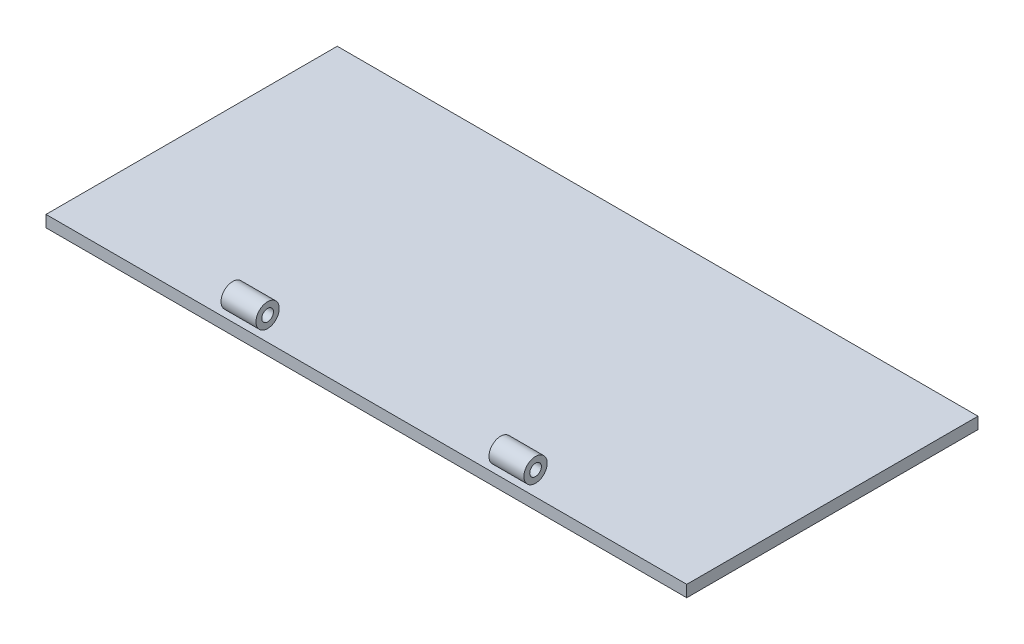
ISO-10303-21;
HEADER;
FILE_DESCRIPTION(('STEP AP214'),'2;1');
FILE_NAME('part.step','',(''),(''),'','','');
FILE_SCHEMA(('AUTOMOTIVE_DESIGN { 1 0 10303 214 1 1 1 1 }'));
ENDSEC;
DATA;
#1=APPLICATION_CONTEXT('core data for automotive mechanical design processes');
#2=APPLICATION_PROTOCOL_DEFINITION('international standard','automotive_design',2000,#1);
#3=PRODUCT_CONTEXT('',#1,'mechanical');
#4=PRODUCT('Part','Part','',(#3));
#5=PRODUCT_RELATED_PRODUCT_CATEGORY('part','',(#4));
#6=PRODUCT_DEFINITION_FORMATION('','',#4);
#7=PRODUCT_DEFINITION_CONTEXT('part definition',#1,'design');
#8=PRODUCT_DEFINITION('design','',#6,#7);
#9=PRODUCT_DEFINITION_SHAPE('','',#8);
#10=(LENGTH_UNIT() NAMED_UNIT(*) SI_UNIT(.MILLI.,.METRE.));
#11=(NAMED_UNIT(*) PLANE_ANGLE_UNIT() SI_UNIT($,.RADIAN.));
#12=(NAMED_UNIT(*) SI_UNIT($,.STERADIAN.) SOLID_ANGLE_UNIT());
#13=UNCERTAINTY_MEASURE_WITH_UNIT(LENGTH_MEASURE(1.E-05),#10,'distance_accuracy_value','');
#14=(GEOMETRIC_REPRESENTATION_CONTEXT(3) GLOBAL_UNCERTAINTY_ASSIGNED_CONTEXT((#13)) GLOBAL_UNIT_ASSIGNED_CONTEXT((#10,
#11,#12)) REPRESENTATION_CONTEXT('',''));
#15=CARTESIAN_POINT('',(0.,0.,0.));
#16=DIRECTION('',(0.,0.,1.));
#17=DIRECTION('',(1.,0.,0.));
#18=AXIS2_PLACEMENT_3D('',#15,#16,#17);
#19=CARTESIAN_POINT('',(180.,27.7098085245449,83.2934951748712));
#20=DIRECTION('',(-1.,0.,0.));
#21=DIRECTION('',(0.,0.,1.));
#22=AXIS2_PLACEMENT_3D('',#19,#20,#21);
#23=CYLINDRICAL_SURFACE('',#22,9.99999999999999);
#24=CARTESIAN_POINT('',(180.,27.7098085245449,83.2934951748712));
#25=DIRECTION('',(-1.,0.,0.));
#26=DIRECTION('',(0.,0.,1.));
#27=AXIS2_PLACEMENT_3D('',#24,#25,#26);
#28=CIRCLE('',#27,9.99999999999999);
#29=CARTESIAN_POINT('',(180.,27.7098085245449,93.2934951748712));
#30=VERTEX_POINT('',#29);
#31=EDGE_CURVE('E12',#30,#30,#28,.T.);
#32=CARTESIAN_POINT('',(150.,27.7098085245449,83.2934951748712));
#33=DIRECTION('',(-1.,0.,0.));
#34=DIRECTION('',(0.,0.,1.));
#35=AXIS2_PLACEMENT_3D('',#32,#33,#34);
#36=CIRCLE('',#35,9.99999999999999);
#37=CARTESIAN_POINT('',(150.,27.7098085245449,93.2934951748712));
#38=VERTEX_POINT('',#37);
#39=EDGE_CURVE('E66',#38,#38,#36,.T.);
#40=CARTESIAN_POINT('',(180.,27.7098085245449,93.2934951748712));
#41=CARTESIAN_POINT('',(179.6875,27.7098085245449,93.2934951748712));
#42=CARTESIAN_POINT('',(179.375,27.7098085245449,93.2934951748712));
#43=CARTESIAN_POINT('',(178.75,27.7098085245449,93.2934951748712));
#44=CARTESIAN_POINT('',(178.4375,27.7098085245449,93.2934951748712));
#45=CARTESIAN_POINT('',(177.8125,27.7098085245449,93.2934951748712));
#46=CARTESIAN_POINT('',(177.5,27.7098085245449,93.2934951748712));
#47=CARTESIAN_POINT('',(176.875,27.7098085245449,93.2934951748712));
#48=CARTESIAN_POINT('',(176.5625,27.7098085245449,93.2934951748712));
#49=CARTESIAN_POINT('',(175.9375,27.7098085245449,93.2934951748712));
#50=CARTESIAN_POINT('',(175.625,27.7098085245449,93.2934951748712));
#51=CARTESIAN_POINT('',(175.,27.7098085245449,93.2934951748712));
#52=CARTESIAN_POINT('',(174.6875,27.7098085245449,93.2934951748712));
#53=CARTESIAN_POINT('',(174.0625,27.7098085245449,93.2934951748712));
#54=CARTESIAN_POINT('',(173.75,27.7098085245449,93.2934951748712));
#55=CARTESIAN_POINT('',(173.125,27.7098085245449,93.2934951748712));
#56=CARTESIAN_POINT('',(172.8125,27.7098085245449,93.2934951748712));
#57=CARTESIAN_POINT('',(172.1875,27.7098085245449,93.2934951748712));
#58=CARTESIAN_POINT('',(171.875,27.7098085245449,93.2934951748712));
#59=CARTESIAN_POINT('',(171.25,27.7098085245449,93.2934951748712));
#60=CARTESIAN_POINT('',(170.9375,27.7098085245449,93.2934951748712));
#61=CARTESIAN_POINT('',(170.3125,27.7098085245449,93.2934951748712));
#62=CARTESIAN_POINT('',(170.,27.7098085245449,93.2934951748712));
#63=CARTESIAN_POINT('',(169.375,27.7098085245449,93.2934951748712));
#64=CARTESIAN_POINT('',(169.0625,27.7098085245449,93.2934951748712));
#65=CARTESIAN_POINT('',(168.4375,27.7098085245449,93.2934951748712));
#66=CARTESIAN_POINT('',(168.125,27.7098085245449,93.2934951748712));
#67=CARTESIAN_POINT('',(167.5,27.7098085245449,93.2934951748712));
#68=CARTESIAN_POINT('',(167.1875,27.7098085245449,93.2934951748712));
#69=CARTESIAN_POINT('',(166.5625,27.7098085245449,93.2934951748712));
#70=CARTESIAN_POINT('',(166.25,27.7098085245449,93.2934951748712));
#71=CARTESIAN_POINT('',(165.625,27.7098085245449,93.2934951748712));
#72=CARTESIAN_POINT('',(165.3125,27.7098085245449,93.2934951748712));
#73=CARTESIAN_POINT('',(164.6875,27.7098085245449,93.2934951748712));
#74=CARTESIAN_POINT('',(164.375,27.7098085245449,93.2934951748712));
#75=CARTESIAN_POINT('',(163.75,27.7098085245449,93.2934951748712));
#76=CARTESIAN_POINT('',(163.4375,27.7098085245449,93.2934951748712));
#77=CARTESIAN_POINT('',(162.8125,27.7098085245449,93.2934951748712));
#78=CARTESIAN_POINT('',(162.5,27.7098085245449,93.2934951748712));
#79=CARTESIAN_POINT('',(161.875,27.7098085245449,93.2934951748712));
#80=CARTESIAN_POINT('',(161.5625,27.7098085245449,93.2934951748712));
#81=CARTESIAN_POINT('',(160.9375,27.7098085245449,93.2934951748712));
#82=CARTESIAN_POINT('',(160.625,27.7098085245449,93.2934951748712));
#83=CARTESIAN_POINT('',(160.,27.7098085245449,93.2934951748712));
#84=CARTESIAN_POINT('',(159.6875,27.7098085245449,93.2934951748712));
#85=CARTESIAN_POINT('',(159.0625,27.7098085245449,93.2934951748712));
#86=CARTESIAN_POINT('',(158.75,27.7098085245449,93.2934951748712));
#87=CARTESIAN_POINT('',(158.125,27.7098085245449,93.2934951748712));
#88=CARTESIAN_POINT('',(157.8125,27.7098085245449,93.2934951748712));
#89=CARTESIAN_POINT('',(157.1875,27.7098085245449,93.2934951748712));
#90=CARTESIAN_POINT('',(156.875,27.7098085245449,93.2934951748712));
#91=CARTESIAN_POINT('',(156.25,27.7098085245449,93.2934951748712));
#92=CARTESIAN_POINT('',(155.9375,27.7098085245449,93.2934951748712));
#93=CARTESIAN_POINT('',(155.3125,27.7098085245449,93.2934951748712));
#94=CARTESIAN_POINT('',(155.,27.7098085245449,93.2934951748712));
#95=CARTESIAN_POINT('',(154.375,27.7098085245449,93.2934951748712));
#96=CARTESIAN_POINT('',(154.0625,27.7098085245449,93.2934951748712));
#97=CARTESIAN_POINT('',(153.4375,27.7098085245449,93.2934951748712));
#98=CARTESIAN_POINT('',(153.125,27.7098085245449,93.2934951748712));
#99=CARTESIAN_POINT('',(152.5,27.7098085245449,93.2934951748712));
#100=CARTESIAN_POINT('',(152.1875,27.7098085245449,93.2934951748712));
#101=CARTESIAN_POINT('',(151.5625,27.7098085245449,93.2934951748712));
#102=CARTESIAN_POINT('',(151.25,27.7098085245449,93.2934951748712));
#103=CARTESIAN_POINT('',(150.625,27.7098085245449,93.2934951748712));
#104=CARTESIAN_POINT('',(150.3125,27.7098085245449,93.2934951748712));
#105=CARTESIAN_POINT('',(150.,27.7098085245449,93.2934951748712));
#106=B_SPLINE_CURVE_WITH_KNOTS('',3,(#40,#41,#42,#43,#44,#45,#46,#47,#48,#49,#50,#51,#52,#53,
#54,#55,#56,#57,#58,#59,#60,#61,#62,#63,#64,#65,#66,#67,#68,#69,#70,#71,#72,#73,#74,#75,#76,#77,
#78,#79,#80,#81,#82,#83,#84,#85,#86,#87,#88,#89,#90,#91,#92,#93,#94,#95,#96,#97,#98,#99,#100,
#101,#102,#103,#104,#105),.UNSPECIFIED.,.F.,.F.,(4,2,2,2,2,2,2,2,2,2,2,2,2,2,2,2,2,2,2,2,2,2,2,
2,2,2,2,2,2,2,2,2,4),(0.,0.937500000000008,1.87500000000002,2.81250000000002,3.75,
4.68750000000001,5.62500000000002,6.56250000000003,7.50000000000001,8.43750000000001,
9.37500000000002,10.3125,11.25,12.1875,13.125,14.0625,15.,15.9375,16.875,17.8125,18.75,19.6875,
20.625,21.5625,22.5,23.4375,24.375,25.3125,26.25,27.1875,28.125,29.0625,30.),.UNSPECIFIED.);
#107=EDGE_CURVE('BSEAM60',#30,#38,#106,.T.);
#108=ORIENTED_EDGE('',*,*,#31,.T.);
#109=ORIENTED_EDGE('',*,*,#39,.F.);
#110=ORIENTED_EDGE('',*,*,#107,.T.);
#111=ORIENTED_EDGE('',*,*,#107,.F.);
#112=EDGE_LOOP('',(#108,#110,#109,#111));
#113=FACE_BOUND('',#112,.T.);
#114=ADVANCED_FACE('F60',(#113),#23,.T.);
#115=CARTESIAN_POINT('',(180.,27.7098085245449,83.2934951748712));
#116=DIRECTION('',(-1.,0.,0.));
#117=DIRECTION('',(0.,0.,1.));
#118=AXIS2_PLACEMENT_3D('',#115,#116,#117);
#119=PLANE('',#118);
#120=CARTESIAN_POINT('',(180.,27.7098085245449,83.2934951748712));
#121=DIRECTION('',(-1.,0.,0.));
#122=DIRECTION('',(0.,0.,1.));
#123=AXIS2_PLACEMENT_3D('',#120,#121,#122);
#124=CIRCLE('',#123,5.);
#125=CARTESIAN_POINT('',(180.,27.7098085245449,88.2934951748712));
#126=VERTEX_POINT('',#125);
#127=EDGE_CURVE('E70',#126,#126,#124,.T.);
#128=ORIENTED_EDGE('',*,*,#127,.T.);
#129=EDGE_LOOP('',(#128));
#130=FACE_BOUND('',#129,.T.);
#131=ORIENTED_EDGE('',*,*,#31,.F.);
#132=EDGE_LOOP('',(#131));
#133=FACE_BOUND('',#132,.T.);
#134=ADVANCED_FACE('F85',(#130,#133),#119,.F.);
#135=CARTESIAN_POINT('',(150.,27.7098085245449,83.2934951748712));
#136=DIRECTION('',(-1.,0.,0.));
#137=DIRECTION('',(0.,0.,1.));
#138=AXIS2_PLACEMENT_3D('',#135,#136,#137);
#139=PLANE('',#138);
#140=CARTESIAN_POINT('',(150.,27.7098085245449,83.2934951748712));
#141=DIRECTION('',(-1.,0.,0.));
#142=DIRECTION('',(0.,0.,1.));
#143=AXIS2_PLACEMENT_3D('',#140,#141,#142);
#144=CIRCLE('',#143,5.);
#145=CARTESIAN_POINT('',(150.,27.7098085245449,88.2934951748712));
#146=VERTEX_POINT('',#145);
#147=EDGE_CURVE('E74',#146,#146,#144,.T.);
#148=ORIENTED_EDGE('',*,*,#147,.F.);
#149=EDGE_LOOP('',(#148));
#150=FACE_BOUND('',#149,.T.);
#151=ORIENTED_EDGE('',*,*,#39,.T.);
#152=EDGE_LOOP('',(#151));
#153=FACE_BOUND('',#152,.T.);
#154=ADVANCED_FACE('F83',(#150,#153),#139,.T.);
#155=CARTESIAN_POINT('',(300.,27.7098085245449,83.2934951748712));
#156=DIRECTION('',(-1.,0.,0.));
#157=DIRECTION('',(0.,0.,1.));
#158=AXIS2_PLACEMENT_3D('',#155,#156,#157);
#159=CYLINDRICAL_SURFACE('',#158,5.);
#160=ORIENTED_EDGE('',*,*,#147,.T.);
#161=EDGE_LOOP('',(#160));
#162=FACE_BOUND('',#161,.T.);
#163=ORIENTED_EDGE('',*,*,#127,.F.);
#164=EDGE_LOOP('',(#163));
#165=FACE_BOUND('',#164,.T.);
#166=ADVANCED_FACE('F80',(#162,#165),#159,.F.);
#167=CLOSED_SHELL('',(#114,#134,#154,#166));
#168=MANIFOLD_SOLID_BREP('B2',#167);
#169=CARTESIAN_POINT('',(550.,0.,-156.484962406015));
#170=DIRECTION('',(0.,0.,-1.));
#171=DIRECTION('',(-1.,0.,0.));
#172=AXIS2_PLACEMENT_3D('',#169,#170,#171);
#173=PLANE('',#172);
#174=DIRECTION('',(0.,-1.,0.));
#175=VECTOR('',#174,1.);
#176=CARTESIAN_POINT('',(0.,0.,-156.484962406015));
#177=LINE('',#176,#175);
#178=CARTESIAN_POINT('',(0.,17.7098085245449,-156.484962406015));
#179=VERTEX_POINT('',#178);
#180=CARTESIAN_POINT('',(0.,7.70980852454485,-156.484962406015));
#181=VERTEX_POINT('',#180);
#182=EDGE_CURVE('E191',#179,#181,#177,.T.);
#183=ORIENTED_EDGE('',*,*,#182,.F.);
#184=DIRECTION('',(-1.,0.,0.));
#185=VECTOR('',#184,1.);
#186=CARTESIAN_POINT('',(550.,17.7098085245449,-156.484962406015));
#187=LINE('',#186,#185);
#188=CARTESIAN_POINT('',(550.,17.7098085245449,-156.484962406015));
#189=VERTEX_POINT('',#188);
#190=EDGE_CURVE('E58',#189,#179,#187,.T.);
#191=ORIENTED_EDGE('',*,*,#190,.F.);
#192=DIRECTION('',(0.,-1.,0.));
#193=VECTOR('',#192,1.);
#194=CARTESIAN_POINT('',(550.,0.,-156.484962406015));
#195=LINE('',#194,#193);
#196=CARTESIAN_POINT('',(550.,7.70980852454485,-156.484962406015));
#197=VERTEX_POINT('',#196);
#198=EDGE_CURVE('E185',#189,#197,#195,.T.);
#199=ORIENTED_EDGE('',*,*,#198,.T.);
#200=DIRECTION('',(-1.,0.,0.));
#201=VECTOR('',#200,1.);
#202=CARTESIAN_POINT('',(550.,7.70980852454485,-156.484962406015));
#203=LINE('',#202,#201);
#204=EDGE_CURVE('E167',#197,#181,#203,.T.);
#205=ORIENTED_EDGE('',*,*,#204,.T.);
#206=EDGE_LOOP('',(#183,#191,#199,#205));
#207=FACE_BOUND('',#206,.T.);
#208=ADVANCED_FACE('F128',(#207),#173,.T.);
#209=CARTESIAN_POINT('',(550.,17.7098085245449,0.));
#210=DIRECTION('',(0.,1.,0.));
#211=DIRECTION('',(0.,0.,1.));
#212=AXIS2_PLACEMENT_3D('',#209,#210,#211);
#213=PLANE('',#212);
#214=ORIENTED_EDGE('',*,*,#190,.T.);
#215=DIRECTION('',(0.,0.,-1.));
#216=VECTOR('',#215,1.);
#217=CARTESIAN_POINT('',(0.,17.7098085245449,0.));
#218=LINE('',#217,#216);
#219=CARTESIAN_POINT('',(0.,17.7098085245449,93.5150375939849));
#220=VERTEX_POINT('',#219);
#221=EDGE_CURVE('E179',#220,#179,#218,.T.);
#222=ORIENTED_EDGE('',*,*,#221,.F.);
#223=DIRECTION('',(-1.,0.,0.));
#224=VECTOR('',#223,1.);
#225=CARTESIAN_POINT('',(550.,17.7098085245449,93.5150375939849));
#226=LINE('',#225,#224);
#227=CARTESIAN_POINT('',(550.,17.7098085245449,93.5150375939849));
#228=VERTEX_POINT('',#227);
#229=EDGE_CURVE('E136',#228,#220,#226,.T.);
#230=ORIENTED_EDGE('',*,*,#229,.F.);
#231=DIRECTION('',(0.,0.,-1.));
#232=VECTOR('',#231,1.);
#233=CARTESIAN_POINT('',(550.,17.7098085245449,0.));
#234=LINE('',#233,#232);
#235=EDGE_CURVE('E174',#228,#189,#234,.T.);
#236=ORIENTED_EDGE('',*,*,#235,.T.);
#237=EDGE_LOOP('',(#214,#222,#230,#236));
#238=FACE_BOUND('',#237,.T.);
#239=ADVANCED_FACE('F178',(#238),#213,.T.);
#240=CARTESIAN_POINT('',(550.,0.,93.5150375939849));
#241=DIRECTION('',(0.,0.,-1.));
#242=DIRECTION('',(-1.,0.,0.));
#243=AXIS2_PLACEMENT_3D('',#240,#241,#242);
#244=PLANE('',#243);
#245=DIRECTION('',(0.,-1.,0.));
#246=VECTOR('',#245,1.);
#247=CARTESIAN_POINT('',(0.,0.,93.5150375939849));
#248=LINE('',#247,#246);
#249=CARTESIAN_POINT('',(0.,7.70980852454485,93.5150375939849));
#250=VERTEX_POINT('',#249);
#251=EDGE_CURVE('E160',#220,#250,#248,.T.);
#252=ORIENTED_EDGE('',*,*,#251,.T.);
#253=DIRECTION('',(-1.,0.,0.));
#254=VECTOR('',#253,1.);
#255=CARTESIAN_POINT('',(550.,7.70980852454485,93.5150375939849));
#256=LINE('',#255,#254);
#257=CARTESIAN_POINT('',(550.,7.70980852454485,93.5150375939849));
#258=VERTEX_POINT('',#257);
#259=EDGE_CURVE('E180',#258,#250,#256,.T.);
#260=ORIENTED_EDGE('',*,*,#259,.F.);
#261=DIRECTION('',(0.,-1.,0.));
#262=VECTOR('',#261,1.);
#263=CARTESIAN_POINT('',(550.,0.,93.5150375939849));
#264=LINE('',#263,#262);
#265=EDGE_CURVE('E181',#228,#258,#264,.T.);
#266=ORIENTED_EDGE('',*,*,#265,.F.);
#267=ORIENTED_EDGE('',*,*,#229,.T.);
#268=EDGE_LOOP('',(#252,#260,#266,#267));
#269=FACE_BOUND('',#268,.T.);
#270=ADVANCED_FACE('F182',(#269),#244,.F.);
#271=CARTESIAN_POINT('',(550.,7.70980852454485,0.));
#272=DIRECTION('',(0.,1.,0.));
#273=DIRECTION('',(0.,0.,1.));
#274=AXIS2_PLACEMENT_3D('',#271,#272,#273);
#275=PLANE('',#274);
#276=DIRECTION('',(0.,0.,-1.));
#277=VECTOR('',#276,1.);
#278=CARTESIAN_POINT('',(0.,7.70980852454485,0.));
#279=LINE('',#278,#277);
#280=EDGE_CURVE('E187',#250,#181,#279,.T.);
#281=ORIENTED_EDGE('',*,*,#280,.T.);
#282=ORIENTED_EDGE('',*,*,#204,.F.);
#283=DIRECTION('',(0.,0.,-1.));
#284=VECTOR('',#283,1.);
#285=CARTESIAN_POINT('',(550.,7.70980852454485,0.));
#286=LINE('',#285,#284);
#287=EDGE_CURVE('E144',#258,#197,#286,.T.);
#288=ORIENTED_EDGE('',*,*,#287,.F.);
#289=ORIENTED_EDGE('',*,*,#259,.T.);
#290=EDGE_LOOP('',(#281,#282,#288,#289));
#291=FACE_BOUND('',#290,.T.);
#292=ADVANCED_FACE('F200',(#291),#275,.F.);
#293=CARTESIAN_POINT('',(550.,0.,0.));
#294=DIRECTION('',(1.,0.,0.));
#295=DIRECTION('',(0.,0.,-1.));
#296=AXIS2_PLACEMENT_3D('',#293,#294,#295);
#297=PLANE('',#296);
#298=ORIENTED_EDGE('',*,*,#198,.F.);
#299=ORIENTED_EDGE('',*,*,#235,.F.);
#300=ORIENTED_EDGE('',*,*,#265,.T.);
#301=ORIENTED_EDGE('',*,*,#287,.T.);
#302=EDGE_LOOP('',(#298,#299,#300,#301));
#303=FACE_BOUND('',#302,.T.);
#304=ADVANCED_FACE('F184',(#303),#297,.T.);
#305=CARTESIAN_POINT('',(0.,0.,0.));
#306=DIRECTION('',(1.,0.,0.));
#307=DIRECTION('',(0.,0.,-1.));
#308=AXIS2_PLACEMENT_3D('',#305,#306,#307);
#309=PLANE('',#308);
#310=ORIENTED_EDGE('',*,*,#182,.T.);
#311=ORIENTED_EDGE('',*,*,#280,.F.);
#312=ORIENTED_EDGE('',*,*,#251,.F.);
#313=ORIENTED_EDGE('',*,*,#221,.T.);
#314=EDGE_LOOP('',(#310,#311,#312,#313));
#315=FACE_BOUND('',#314,.T.);
#316=ADVANCED_FACE('F202',(#315),#309,.F.);
#317=CLOSED_SHELL('',(#208,#239,#270,#292,#304,#316));
#318=MANIFOLD_SOLID_BREP('B7',#317);
#319=CARTESIAN_POINT('',(550.,27.7098085245449,83.2934951748712));
#320=DIRECTION('',(-1.,0.,0.));
#321=DIRECTION('',(0.,0.,1.));
#322=AXIS2_PLACEMENT_3D('',#319,#320,#321);
#323=CYLINDRICAL_SURFACE('',#322,9.99999999999999);
#324=CARTESIAN_POINT('',(410.,27.7098085245449,83.2934951748712));
#325=DIRECTION('',(1.,0.,0.));
#326=DIRECTION('',(0.,0.,-1.));
#327=AXIS2_PLACEMENT_3D('',#324,#325,#326);
#328=CIRCLE('',#327,9.99999999999999);
#329=CARTESIAN_POINT('',(410.,27.7098085245449,73.2934951748712));
#330=VERTEX_POINT('',#329);
#331=EDGE_CURVE('E127',#330,#330,#328,.T.);
#332=ORIENTED_EDGE('',*,*,#331,.F.);
#333=EDGE_LOOP('',(#332));
#334=FACE_BOUND('',#333,.T.);
#335=CARTESIAN_POINT('',(380.,27.7098085245449,83.2934951748712));
#336=DIRECTION('',(-1.,0.,0.));
#337=DIRECTION('',(0.,0.,1.));
#338=AXIS2_PLACEMENT_3D('',#335,#336,#337);
#339=CIRCLE('',#338,9.99999999999999);
#340=CARTESIAN_POINT('',(380.,27.7098085245449,93.2934951748712));
#341=VERTEX_POINT('',#340);
#342=EDGE_CURVE('E259',#341,#341,#339,.T.);
#343=ORIENTED_EDGE('',*,*,#342,.F.);
#344=EDGE_LOOP('',(#343));
#345=FACE_BOUND('',#344,.T.);
#346=ADVANCED_FACE('F253',(#334,#345),#323,.T.);
#347=CARTESIAN_POINT('',(410.,27.7098085245449,83.2934951748712));
#348=DIRECTION('',(1.,0.,0.));
#349=DIRECTION('',(0.,0.,-1.));
#350=AXIS2_PLACEMENT_3D('',#347,#348,#349);
#351=PLANE('',#350);
#352=CARTESIAN_POINT('',(410.,27.7098085245449,83.2934951748712));
#353=DIRECTION('',(1.,0.,0.));
#354=DIRECTION('',(0.,0.,-1.));
#355=AXIS2_PLACEMENT_3D('',#352,#353,#354);
#356=CIRCLE('',#355,5.);
#357=CARTESIAN_POINT('',(410.,27.7098085245449,78.2934951748712));
#358=VERTEX_POINT('',#357);
#359=EDGE_CURVE('E263',#358,#358,#356,.T.);
#360=ORIENTED_EDGE('',*,*,#359,.F.);
#361=EDGE_LOOP('',(#360));
#362=FACE_BOUND('',#361,.T.);
#363=ORIENTED_EDGE('',*,*,#331,.T.);
#364=EDGE_LOOP('',(#363));
#365=FACE_BOUND('',#364,.T.);
#366=ADVANCED_FACE('F277',(#362,#365),#351,.T.);
#367=CARTESIAN_POINT('',(380.,27.7098085245449,83.2934951748712));
#368=DIRECTION('',(-1.,0.,0.));
#369=DIRECTION('',(0.,0.,1.));
#370=AXIS2_PLACEMENT_3D('',#367,#368,#369);
#371=PLANE('',#370);
#372=CARTESIAN_POINT('',(380.,27.7098085245449,83.2934951748712));
#373=DIRECTION('',(-1.,0.,0.));
#374=DIRECTION('',(0.,0.,1.));
#375=AXIS2_PLACEMENT_3D('',#372,#373,#374);
#376=CIRCLE('',#375,5.);
#377=CARTESIAN_POINT('',(380.,27.7098085245449,88.2934951748712));
#378=VERTEX_POINT('',#377);
#379=EDGE_CURVE('E267',#378,#378,#376,.T.);
#380=ORIENTED_EDGE('',*,*,#379,.F.);
#381=EDGE_LOOP('',(#380));
#382=FACE_BOUND('',#381,.T.);
#383=ORIENTED_EDGE('',*,*,#342,.T.);
#384=EDGE_LOOP('',(#383));
#385=FACE_BOUND('',#384,.T.);
#386=ADVANCED_FACE('F275',(#382,#385),#371,.T.);
#387=CARTESIAN_POINT('',(760.,27.7098085245449,83.2934951748712));
#388=DIRECTION('',(-1.,0.,0.));
#389=DIRECTION('',(0.,0.,1.));
#390=AXIS2_PLACEMENT_3D('',#387,#388,#389);
#391=CYLINDRICAL_SURFACE('',#390,5.);
#392=ORIENTED_EDGE('',*,*,#359,.T.);
#393=EDGE_LOOP('',(#392));
#394=FACE_BOUND('',#393,.T.);
#395=ORIENTED_EDGE('',*,*,#379,.T.);
#396=EDGE_LOOP('',(#395));
#397=FACE_BOUND('',#396,.T.);
#398=ADVANCED_FACE('F273',(#394,#397),#391,.F.);
#399=CLOSED_SHELL('',(#346,#366,#386,#398));
#400=MANIFOLD_SOLID_BREP('B52',#399);
#401=ADVANCED_BREP_SHAPE_REPRESENTATION('',(#18,#168,#318,#400),#14);
#402=SHAPE_DEFINITION_REPRESENTATION(#9,#401);
ENDSEC;
END-ISO-10303-21;
